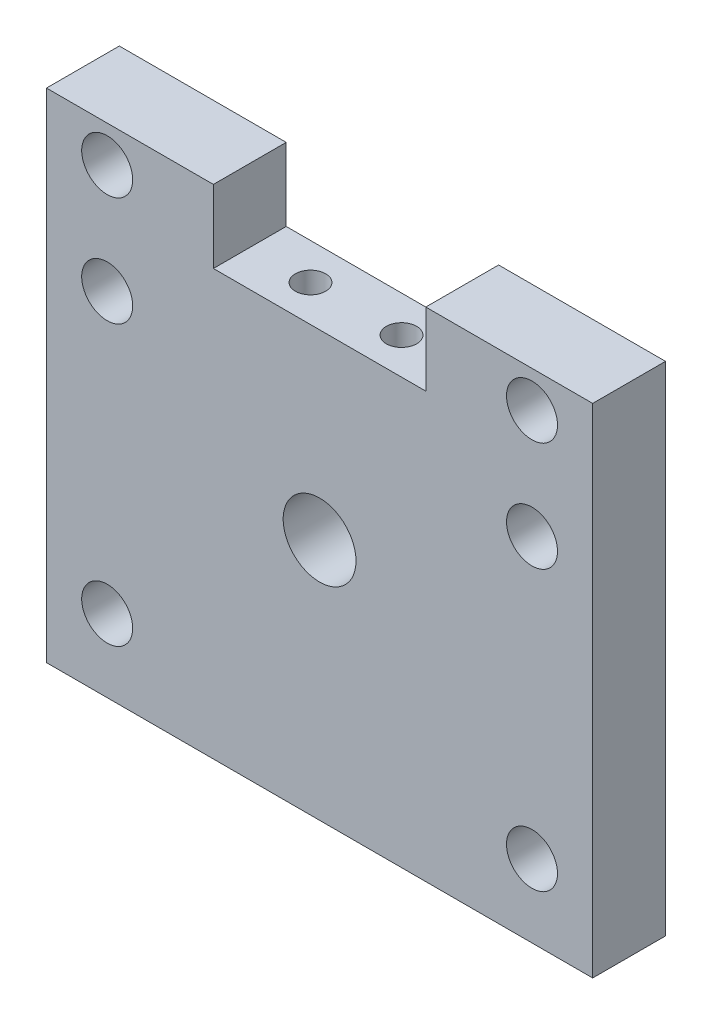
ISO-10303-21;
HEADER;
FILE_DESCRIPTION(('STEP AP214'),'2;1');
FILE_NAME('part.step','',(''),(''),'','','');
FILE_SCHEMA(('AUTOMOTIVE_DESIGN { 1 0 10303 214 1 1 1 1 }'));
ENDSEC;
DATA;
#1=APPLICATION_CONTEXT('core data for automotive mechanical design processes');
#2=APPLICATION_PROTOCOL_DEFINITION('international standard','automotive_design',2000,#1);
#3=PRODUCT_CONTEXT('',#1,'mechanical');
#4=PRODUCT('Part','Part','',(#3));
#5=PRODUCT_RELATED_PRODUCT_CATEGORY('part','',(#4));
#6=PRODUCT_DEFINITION_FORMATION('','',#4);
#7=PRODUCT_DEFINITION_CONTEXT('part definition',#1,'design');
#8=PRODUCT_DEFINITION('design','',#6,#7);
#9=PRODUCT_DEFINITION_SHAPE('','',#8);
#10=(LENGTH_UNIT() NAMED_UNIT(*) SI_UNIT(.MILLI.,.METRE.));
#11=(NAMED_UNIT(*) PLANE_ANGLE_UNIT() SI_UNIT($,.RADIAN.));
#12=(NAMED_UNIT(*) SI_UNIT($,.STERADIAN.) SOLID_ANGLE_UNIT());
#13=UNCERTAINTY_MEASURE_WITH_UNIT(LENGTH_MEASURE(1.E-05),#10,'distance_accuracy_value','');
#14=(GEOMETRIC_REPRESENTATION_CONTEXT(3) GLOBAL_UNCERTAINTY_ASSIGNED_CONTEXT((#13)) GLOBAL_UNIT_ASSIGNED_CONTEXT((#10,
#11,#12)) REPRESENTATION_CONTEXT('',''));
#15=CARTESIAN_POINT('',(0.,0.,0.));
#16=DIRECTION('',(0.,0.,1.));
#17=DIRECTION('',(1.,0.,0.));
#18=AXIS2_PLACEMENT_3D('',#15,#16,#17);
#19=CARTESIAN_POINT('',(-45.,41.,6.));
#20=DIRECTION('',(0.,1.,0.));
#21=DIRECTION('',(0.,0.,1.));
#22=AXIS2_PLACEMENT_3D('',#19,#20,#21);
#23=PLANE('',#22);
#24=DIRECTION('',(1.,0.,0.));
#25=VECTOR('',#24,1.);
#26=CARTESIAN_POINT('',(-45.,41.,-6.));
#27=LINE('',#26,#25);
#28=CARTESIAN_POINT('',(17.5,41.,-6.));
#29=VERTEX_POINT('',#28);
#30=CARTESIAN_POINT('',(45.,41.,-6.));
#31=VERTEX_POINT('',#30);
#32=EDGE_CURVE('E225',#29,#31,#27,.T.);
#33=ORIENTED_EDGE('',*,*,#32,.F.);
#34=DIRECTION('',(0.,0.,1.));
#35=VECTOR('',#34,1.);
#36=CARTESIAN_POINT('',(17.5,41.,6.));
#37=LINE('',#36,#35);
#38=CARTESIAN_POINT('',(17.5,41.,6.));
#39=VERTEX_POINT('',#38);
#40=EDGE_CURVE('E172',#29,#39,#37,.T.);
#41=ORIENTED_EDGE('',*,*,#40,.T.);
#42=DIRECTION('',(1.,0.,0.));
#43=VECTOR('',#42,1.);
#44=CARTESIAN_POINT('',(-45.,41.,6.));
#45=LINE('',#44,#43);
#46=CARTESIAN_POINT('',(45.,41.,6.));
#47=VERTEX_POINT('',#46);
#48=EDGE_CURVE('E214',#39,#47,#45,.T.);
#49=ORIENTED_EDGE('',*,*,#48,.T.);
#50=DIRECTION('',(0.,0.,-1.));
#51=VECTOR('',#50,1.);
#52=CARTESIAN_POINT('',(45.,41.,6.));
#53=LINE('',#52,#51);
#54=EDGE_CURVE('E237',#47,#31,#53,.T.);
#55=ORIENTED_EDGE('',*,*,#54,.T.);
#56=EDGE_LOOP('',(#33,#41,#49,#55));
#57=FACE_BOUND('',#56,.T.);
#58=ADVANCED_FACE('F51',(#57),#23,.T.);
#59=CARTESIAN_POINT('',(-45.,41.,6.));
#60=VERTEX_POINT('',#59);
#61=CARTESIAN_POINT('',(-17.5,41.,6.));
#62=VERTEX_POINT('',#61);
#63=EDGE_CURVE('E216',#60,#62,#45,.T.);
#64=ORIENTED_EDGE('',*,*,#63,.T.);
#65=DIRECTION('',(0.,0.,-1.));
#66=VECTOR('',#65,1.);
#67=CARTESIAN_POINT('',(-17.5,41.,6.));
#68=LINE('',#67,#66);
#69=CARTESIAN_POINT('',(-17.5,41.,-6.));
#70=VERTEX_POINT('',#69);
#71=EDGE_CURVE('E169',#62,#70,#68,.T.);
#72=ORIENTED_EDGE('',*,*,#71,.T.);
#73=CARTESIAN_POINT('',(-45.,41.,-6.));
#74=VERTEX_POINT('',#73);
#75=EDGE_CURVE('E226',#74,#70,#27,.T.);
#76=ORIENTED_EDGE('',*,*,#75,.F.);
#77=DIRECTION('',(0.,0.,-1.));
#78=VECTOR('',#77,1.);
#79=CARTESIAN_POINT('',(-45.,41.,6.));
#80=LINE('',#79,#78);
#81=EDGE_CURVE('E100',#60,#74,#80,.T.);
#82=ORIENTED_EDGE('',*,*,#81,.F.);
#83=EDGE_LOOP('',(#64,#72,#76,#82));
#84=FACE_BOUND('',#83,.T.);
#85=ADVANCED_FACE('F247',(#84),#23,.T.);
#86=CARTESIAN_POINT('',(0.,0.,6.));
#87=DIRECTION('',(0.,0.,-1.));
#88=DIRECTION('',(-1.,0.,0.));
#89=AXIS2_PLACEMENT_3D('',#86,#87,#88);
#90=PLANE('',#89);
#91=CARTESIAN_POINT('',(0.,-0.999999999999997,6.));
#92=DIRECTION('',(0.,0.,1.));
#93=DIRECTION('',(1.,0.,0.));
#94=AXIS2_PLACEMENT_3D('',#91,#92,#93);
#95=CIRCLE('',#94,6.);
#96=CARTESIAN_POINT('',(6.,-0.999999999999997,6.));
#97=VERTEX_POINT('',#96);
#98=EDGE_CURVE('E150',#97,#97,#95,.T.);
#99=ORIENTED_EDGE('',*,*,#98,.F.);
#100=EDGE_LOOP('',(#99));
#101=FACE_BOUND('',#100,.T.);
#102=CARTESIAN_POINT('',(35.,35.,6.));
#103=DIRECTION('',(0.,0.,1.));
#104=DIRECTION('',(1.,0.,0.));
#105=AXIS2_PLACEMENT_3D('',#102,#103,#104);
#106=CIRCLE('',#105,4.19999999999999);
#107=CARTESIAN_POINT('',(39.2,35.,6.));
#108=VERTEX_POINT('',#107);
#109=EDGE_CURVE('E205',#108,#108,#106,.T.);
#110=ORIENTED_EDGE('',*,*,#109,.F.);
#111=EDGE_LOOP('',(#110));
#112=FACE_BOUND('',#111,.T.);
#113=CARTESIAN_POINT('',(-35.,35.,6.));
#114=DIRECTION('',(0.,0.,1.));
#115=DIRECTION('',(1.,0.,0.));
#116=AXIS2_PLACEMENT_3D('',#113,#114,#115);
#117=CIRCLE('',#116,4.19999999999999);
#118=CARTESIAN_POINT('',(-30.8,35.,6.));
#119=VERTEX_POINT('',#118);
#120=EDGE_CURVE('E199',#119,#119,#117,.T.);
#121=ORIENTED_EDGE('',*,*,#120,.F.);
#122=EDGE_LOOP('',(#121));
#123=FACE_BOUND('',#122,.T.);
#124=CARTESIAN_POINT('',(-35.,-29.,6.));
#125=DIRECTION('',(0.,0.,1.));
#126=DIRECTION('',(1.,0.,0.));
#127=AXIS2_PLACEMENT_3D('',#124,#125,#126);
#128=CIRCLE('',#127,4.19999999999999);
#129=CARTESIAN_POINT('',(-30.8,-29.,6.));
#130=VERTEX_POINT('',#129);
#131=EDGE_CURVE('E193',#130,#130,#128,.T.);
#132=ORIENTED_EDGE('',*,*,#131,.F.);
#133=EDGE_LOOP('',(#132));
#134=FACE_BOUND('',#133,.T.);
#135=CARTESIAN_POINT('',(35.,-29.,6.));
#136=DIRECTION('',(0.,0.,1.));
#137=DIRECTION('',(1.,0.,0.));
#138=AXIS2_PLACEMENT_3D('',#135,#136,#137);
#139=CIRCLE('',#138,4.19999999999999);
#140=CARTESIAN_POINT('',(39.2,-29.,6.));
#141=VERTEX_POINT('',#140);
#142=EDGE_CURVE('E187',#141,#141,#139,.T.);
#143=ORIENTED_EDGE('',*,*,#142,.F.);
#144=EDGE_LOOP('',(#143));
#145=FACE_BOUND('',#144,.T.);
#146=CARTESIAN_POINT('',(35.,17.,6.));
#147=DIRECTION('',(0.,0.,1.));
#148=DIRECTION('',(1.,0.,0.));
#149=AXIS2_PLACEMENT_3D('',#146,#147,#148);
#150=CIRCLE('',#149,4.19999999999999);
#151=CARTESIAN_POINT('',(39.2,17.,6.));
#152=VERTEX_POINT('',#151);
#153=EDGE_CURVE('E181',#152,#152,#150,.T.);
#154=ORIENTED_EDGE('',*,*,#153,.F.);
#155=EDGE_LOOP('',(#154));
#156=FACE_BOUND('',#155,.T.);
#157=CARTESIAN_POINT('',(-35.,17.,6.));
#158=DIRECTION('',(0.,0.,1.));
#159=DIRECTION('',(1.,0.,0.));
#160=AXIS2_PLACEMENT_3D('',#157,#158,#159);
#161=CIRCLE('',#160,4.19999999999999);
#162=CARTESIAN_POINT('',(-30.8,17.,6.));
#163=VERTEX_POINT('',#162);
#164=EDGE_CURVE('E175',#163,#163,#161,.T.);
#165=ORIENTED_EDGE('',*,*,#164,.F.);
#166=EDGE_LOOP('',(#165));
#167=FACE_BOUND('',#166,.T.);
#168=DIRECTION('',(0.,-1.,0.));
#169=VECTOR('',#168,1.);
#170=CARTESIAN_POINT('',(17.5,41.000012,6.));
#171=LINE('',#170,#169);
#172=CARTESIAN_POINT('',(17.5,29.,6.));
#173=VERTEX_POINT('',#172);
#174=EDGE_CURVE('E164',#39,#173,#171,.T.);
#175=ORIENTED_EDGE('',*,*,#174,.T.);
#176=DIRECTION('',(1.,0.,0.));
#177=VECTOR('',#176,1.);
#178=CARTESIAN_POINT('',(17.5,29.,6.));
#179=LINE('',#178,#177);
#180=CARTESIAN_POINT('',(-17.5,29.,6.));
#181=VERTEX_POINT('',#180);
#182=EDGE_CURVE('E162',#181,#173,#179,.T.);
#183=ORIENTED_EDGE('',*,*,#182,.F.);
#184=DIRECTION('',(0.,-1.,0.));
#185=VECTOR('',#184,1.);
#186=CARTESIAN_POINT('',(-17.5,41.000012,6.));
#187=LINE('',#186,#185);
#188=EDGE_CURVE('E167',#62,#181,#187,.T.);
#189=ORIENTED_EDGE('',*,*,#188,.F.);
#190=ORIENTED_EDGE('',*,*,#63,.F.);
#191=DIRECTION('',(0.,1.,0.));
#192=VECTOR('',#191,1.);
#193=CARTESIAN_POINT('',(-45.,-41.,6.));
#194=LINE('',#193,#192);
#195=CARTESIAN_POINT('',(-45.,-41.,6.));
#196=VERTEX_POINT('',#195);
#197=EDGE_CURVE('E212',#196,#60,#194,.T.);
#198=ORIENTED_EDGE('',*,*,#197,.F.);
#199=DIRECTION('',(1.,0.,0.));
#200=VECTOR('',#199,1.);
#201=CARTESIAN_POINT('',(-45.,-41.,6.));
#202=LINE('',#201,#200);
#203=CARTESIAN_POINT('',(45.,-41.,6.));
#204=VERTEX_POINT('',#203);
#205=EDGE_CURVE('E221',#196,#204,#202,.T.);
#206=ORIENTED_EDGE('',*,*,#205,.T.);
#207=DIRECTION('',(0.,1.,0.));
#208=VECTOR('',#207,1.);
#209=CARTESIAN_POINT('',(45.,-41.,6.));
#210=LINE('',#209,#208);
#211=EDGE_CURVE('E218',#204,#47,#210,.T.);
#212=ORIENTED_EDGE('',*,*,#211,.T.);
#213=ORIENTED_EDGE('',*,*,#48,.F.);
#214=EDGE_LOOP('',(#175,#183,#189,#190,#198,#206,#212,#213));
#215=FACE_BOUND('',#214,.T.);
#216=ADVANCED_FACE('F250',(#101,#112,#123,#134,#145,#156,#167,#215),#90,.F.);
#217=CARTESIAN_POINT('',(0.,0.,-6.));
#218=DIRECTION('',(0.,0.,-1.));
#219=DIRECTION('',(-1.,0.,0.));
#220=AXIS2_PLACEMENT_3D('',#217,#218,#219);
#221=PLANE('',#220);
#222=CARTESIAN_POINT('',(0.,-0.999999999999997,-6.));
#223=DIRECTION('',(0.,0.,1.));
#224=DIRECTION('',(1.,0.,0.));
#225=AXIS2_PLACEMENT_3D('',#222,#223,#224);
#226=CIRCLE('',#225,6.);
#227=CARTESIAN_POINT('',(6.,-0.999999999999997,-6.));
#228=VERTEX_POINT('',#227);
#229=EDGE_CURVE('E153',#228,#228,#226,.T.);
#230=ORIENTED_EDGE('',*,*,#229,.T.);
#231=EDGE_LOOP('',(#230));
#232=FACE_BOUND('',#231,.T.);
#233=CARTESIAN_POINT('',(-35.,17.,-6.));
#234=DIRECTION('',(0.,0.,1.));
#235=DIRECTION('',(1.,0.,0.));
#236=AXIS2_PLACEMENT_3D('',#233,#234,#235);
#237=CIRCLE('',#236,4.2);
#238=CARTESIAN_POINT('',(-30.8,17.,-6.));
#239=VERTEX_POINT('',#238);
#240=EDGE_CURVE('E178',#239,#239,#237,.T.);
#241=ORIENTED_EDGE('',*,*,#240,.T.);
#242=EDGE_LOOP('',(#241));
#243=FACE_BOUND('',#242,.T.);
#244=CARTESIAN_POINT('',(35.,17.,-6.));
#245=DIRECTION('',(0.,0.,1.));
#246=DIRECTION('',(1.,0.,0.));
#247=AXIS2_PLACEMENT_3D('',#244,#245,#246);
#248=CIRCLE('',#247,4.2);
#249=CARTESIAN_POINT('',(39.2,17.,-6.));
#250=VERTEX_POINT('',#249);
#251=EDGE_CURVE('E184',#250,#250,#248,.T.);
#252=ORIENTED_EDGE('',*,*,#251,.T.);
#253=EDGE_LOOP('',(#252));
#254=FACE_BOUND('',#253,.T.);
#255=CARTESIAN_POINT('',(35.,-29.,-6.));
#256=DIRECTION('',(0.,0.,1.));
#257=DIRECTION('',(1.,0.,0.));
#258=AXIS2_PLACEMENT_3D('',#255,#256,#257);
#259=CIRCLE('',#258,4.2);
#260=CARTESIAN_POINT('',(39.2,-29.,-6.));
#261=VERTEX_POINT('',#260);
#262=EDGE_CURVE('E190',#261,#261,#259,.T.);
#263=ORIENTED_EDGE('',*,*,#262,.T.);
#264=EDGE_LOOP('',(#263));
#265=FACE_BOUND('',#264,.T.);
#266=CARTESIAN_POINT('',(-35.,-29.,-6.));
#267=DIRECTION('',(0.,0.,1.));
#268=DIRECTION('',(1.,0.,0.));
#269=AXIS2_PLACEMENT_3D('',#266,#267,#268);
#270=CIRCLE('',#269,4.2);
#271=CARTESIAN_POINT('',(-30.8,-29.,-6.));
#272=VERTEX_POINT('',#271);
#273=EDGE_CURVE('E196',#272,#272,#270,.T.);
#274=ORIENTED_EDGE('',*,*,#273,.T.);
#275=EDGE_LOOP('',(#274));
#276=FACE_BOUND('',#275,.T.);
#277=CARTESIAN_POINT('',(-35.,35.,-6.));
#278=DIRECTION('',(0.,0.,1.));
#279=DIRECTION('',(1.,0.,0.));
#280=AXIS2_PLACEMENT_3D('',#277,#278,#279);
#281=CIRCLE('',#280,4.2);
#282=CARTESIAN_POINT('',(-30.8,35.,-6.));
#283=VERTEX_POINT('',#282);
#284=EDGE_CURVE('E202',#283,#283,#281,.T.);
#285=ORIENTED_EDGE('',*,*,#284,.T.);
#286=EDGE_LOOP('',(#285));
#287=FACE_BOUND('',#286,.T.);
#288=CARTESIAN_POINT('',(35.,35.,-6.));
#289=DIRECTION('',(0.,0.,1.));
#290=DIRECTION('',(1.,0.,0.));
#291=AXIS2_PLACEMENT_3D('',#288,#289,#290);
#292=CIRCLE('',#291,4.2);
#293=CARTESIAN_POINT('',(39.2,35.,-6.));
#294=VERTEX_POINT('',#293);
#295=EDGE_CURVE('E208',#294,#294,#292,.T.);
#296=ORIENTED_EDGE('',*,*,#295,.T.);
#297=EDGE_LOOP('',(#296));
#298=FACE_BOUND('',#297,.T.);
#299=DIRECTION('',(-1.,0.,0.));
#300=VECTOR('',#299,1.);
#301=CARTESIAN_POINT('',(17.5,29.,-6.));
#302=LINE('',#301,#300);
#303=CARTESIAN_POINT('',(17.5,29.,-6.));
#304=VERTEX_POINT('',#303);
#305=CARTESIAN_POINT('',(-17.5,29.,-6.));
#306=VERTEX_POINT('',#305);
#307=EDGE_CURVE('E157',#304,#306,#302,.T.);
#308=ORIENTED_EDGE('',*,*,#307,.F.);
#309=DIRECTION('',(0.,1.,0.));
#310=VECTOR('',#309,1.);
#311=CARTESIAN_POINT('',(17.5,0.,-6.));
#312=LINE('',#311,#310);
#313=EDGE_CURVE('E11',#304,#29,#312,.T.);
#314=ORIENTED_EDGE('',*,*,#313,.T.);
#315=ORIENTED_EDGE('',*,*,#32,.T.);
#316=DIRECTION('',(0.,1.,0.));
#317=VECTOR('',#316,1.);
#318=CARTESIAN_POINT('',(45.,-41.,-6.));
#319=LINE('',#318,#317);
#320=CARTESIAN_POINT('',(45.,-41.,-6.));
#321=VERTEX_POINT('',#320);
#322=EDGE_CURVE('E229',#321,#31,#319,.T.);
#323=ORIENTED_EDGE('',*,*,#322,.F.);
#324=DIRECTION('',(1.,0.,0.));
#325=VECTOR('',#324,1.);
#326=CARTESIAN_POINT('',(-45.,-41.,-6.));
#327=LINE('',#326,#325);
#328=CARTESIAN_POINT('',(-45.,-41.,-6.));
#329=VERTEX_POINT('',#328);
#330=EDGE_CURVE('E215',#329,#321,#327,.T.);
#331=ORIENTED_EDGE('',*,*,#330,.F.);
#332=DIRECTION('',(0.,1.,0.));
#333=VECTOR('',#332,1.);
#334=CARTESIAN_POINT('',(-45.,-41.,-6.));
#335=LINE('',#334,#333);
#336=EDGE_CURVE('E211',#329,#74,#335,.T.);
#337=ORIENTED_EDGE('',*,*,#336,.T.);
#338=ORIENTED_EDGE('',*,*,#75,.T.);
#339=DIRECTION('',(0.,-1.,0.));
#340=VECTOR('',#339,1.);
#341=CARTESIAN_POINT('',(-17.5,0.,-6.));
#342=LINE('',#341,#340);
#343=EDGE_CURVE('E59',#70,#306,#342,.T.);
#344=ORIENTED_EDGE('',*,*,#343,.T.);
#345=EDGE_LOOP('',(#308,#314,#315,#323,#331,#337,#338,#344));
#346=FACE_BOUND('',#345,.T.);
#347=ADVANCED_FACE('F243',(#232,#243,#254,#265,#276,#287,#298,#346),#221,.T.);
#348=CARTESIAN_POINT('',(-45.,-41.,6.));
#349=DIRECTION('',(-1.,0.,0.));
#350=DIRECTION('',(0.,0.,1.));
#351=AXIS2_PLACEMENT_3D('',#348,#349,#350);
#352=PLANE('',#351);
#353=ORIENTED_EDGE('',*,*,#336,.F.);
#354=DIRECTION('',(0.,0.,-1.));
#355=VECTOR('',#354,1.);
#356=CARTESIAN_POINT('',(-45.,-41.,6.));
#357=LINE('',#356,#355);
#358=EDGE_CURVE('E75',#196,#329,#357,.T.);
#359=ORIENTED_EDGE('',*,*,#358,.F.);
#360=ORIENTED_EDGE('',*,*,#197,.T.);
#361=ORIENTED_EDGE('',*,*,#81,.T.);
#362=EDGE_LOOP('',(#353,#359,#360,#361));
#363=FACE_BOUND('',#362,.T.);
#364=ADVANCED_FACE('F53',(#363),#352,.T.);
#365=CARTESIAN_POINT('',(-45.,-41.,6.));
#366=DIRECTION('',(0.,1.,0.));
#367=DIRECTION('',(0.,0.,1.));
#368=AXIS2_PLACEMENT_3D('',#365,#366,#367);
#369=PLANE('',#368);
#370=ORIENTED_EDGE('',*,*,#330,.T.);
#371=DIRECTION('',(0.,0.,-1.));
#372=VECTOR('',#371,1.);
#373=CARTESIAN_POINT('',(45.,-41.,6.));
#374=LINE('',#373,#372);
#375=EDGE_CURVE('E234',#204,#321,#374,.T.);
#376=ORIENTED_EDGE('',*,*,#375,.F.);
#377=ORIENTED_EDGE('',*,*,#205,.F.);
#378=ORIENTED_EDGE('',*,*,#358,.T.);
#379=EDGE_LOOP('',(#370,#376,#377,#378));
#380=FACE_BOUND('',#379,.T.);
#381=ADVANCED_FACE('F254',(#380),#369,.F.);
#382=CARTESIAN_POINT('',(45.,-41.,6.));
#383=DIRECTION('',(-1.,0.,0.));
#384=DIRECTION('',(0.,0.,1.));
#385=AXIS2_PLACEMENT_3D('',#382,#383,#384);
#386=PLANE('',#385);
#387=ORIENTED_EDGE('',*,*,#322,.T.);
#388=ORIENTED_EDGE('',*,*,#54,.F.);
#389=ORIENTED_EDGE('',*,*,#211,.F.);
#390=ORIENTED_EDGE('',*,*,#375,.T.);
#391=EDGE_LOOP('',(#387,#388,#389,#390));
#392=FACE_BOUND('',#391,.T.);
#393=ADVANCED_FACE('F257',(#392),#386,.F.);
#394=CARTESIAN_POINT('',(35.,35.,6.));
#395=DIRECTION('',(0.,0.,1.));
#396=DIRECTION('',(1.,0.,0.));
#397=AXIS2_PLACEMENT_3D('',#394,#395,#396);
#398=CYLINDRICAL_SURFACE('',#397,4.19999999999999);
#399=ORIENTED_EDGE('',*,*,#295,.F.);
#400=EDGE_LOOP('',(#399));
#401=FACE_BOUND('',#400,.T.);
#402=ORIENTED_EDGE('',*,*,#109,.T.);
#403=EDGE_LOOP('',(#402));
#404=FACE_BOUND('',#403,.T.);
#405=ADVANCED_FACE('F287',(#401,#404),#398,.F.);
#406=CARTESIAN_POINT('',(-35.,35.,6.));
#407=DIRECTION('',(0.,0.,1.));
#408=DIRECTION('',(1.,0.,0.));
#409=AXIS2_PLACEMENT_3D('',#406,#407,#408);
#410=CYLINDRICAL_SURFACE('',#409,4.19999999999999);
#411=ORIENTED_EDGE('',*,*,#284,.F.);
#412=EDGE_LOOP('',(#411));
#413=FACE_BOUND('',#412,.T.);
#414=ORIENTED_EDGE('',*,*,#120,.T.);
#415=EDGE_LOOP('',(#414));
#416=FACE_BOUND('',#415,.T.);
#417=ADVANCED_FACE('F298',(#413,#416),#410,.F.);
#418=CARTESIAN_POINT('',(-35.,-29.,6.));
#419=DIRECTION('',(0.,0.,1.));
#420=DIRECTION('',(1.,0.,0.));
#421=AXIS2_PLACEMENT_3D('',#418,#419,#420);
#422=CYLINDRICAL_SURFACE('',#421,4.19999999999999);
#423=ORIENTED_EDGE('',*,*,#273,.F.);
#424=EDGE_LOOP('',(#423));
#425=FACE_BOUND('',#424,.T.);
#426=ORIENTED_EDGE('',*,*,#131,.T.);
#427=EDGE_LOOP('',(#426));
#428=FACE_BOUND('',#427,.T.);
#429=ADVANCED_FACE('F302',(#425,#428),#422,.F.);
#430=CARTESIAN_POINT('',(35.,-29.,6.));
#431=DIRECTION('',(0.,0.,1.));
#432=DIRECTION('',(1.,0.,0.));
#433=AXIS2_PLACEMENT_3D('',#430,#431,#432);
#434=CYLINDRICAL_SURFACE('',#433,4.19999999999999);
#435=ORIENTED_EDGE('',*,*,#262,.F.);
#436=EDGE_LOOP('',(#435));
#437=FACE_BOUND('',#436,.T.);
#438=ORIENTED_EDGE('',*,*,#142,.T.);
#439=EDGE_LOOP('',(#438));
#440=FACE_BOUND('',#439,.T.);
#441=ADVANCED_FACE('F306',(#437,#440),#434,.F.);
#442=CARTESIAN_POINT('',(35.,17.,6.));
#443=DIRECTION('',(0.,0.,1.));
#444=DIRECTION('',(1.,0.,0.));
#445=AXIS2_PLACEMENT_3D('',#442,#443,#444);
#446=CYLINDRICAL_SURFACE('',#445,4.19999999999999);
#447=ORIENTED_EDGE('',*,*,#251,.F.);
#448=EDGE_LOOP('',(#447));
#449=FACE_BOUND('',#448,.T.);
#450=ORIENTED_EDGE('',*,*,#153,.T.);
#451=EDGE_LOOP('',(#450));
#452=FACE_BOUND('',#451,.T.);
#453=ADVANCED_FACE('F310',(#449,#452),#446,.F.);
#454=CARTESIAN_POINT('',(-35.,17.,6.));
#455=DIRECTION('',(0.,0.,1.));
#456=DIRECTION('',(1.,0.,0.));
#457=AXIS2_PLACEMENT_3D('',#454,#455,#456);
#458=CYLINDRICAL_SURFACE('',#457,4.19999999999999);
#459=ORIENTED_EDGE('',*,*,#240,.F.);
#460=EDGE_LOOP('',(#459));
#461=FACE_BOUND('',#460,.T.);
#462=ORIENTED_EDGE('',*,*,#164,.T.);
#463=EDGE_LOOP('',(#462));
#464=FACE_BOUND('',#463,.T.);
#465=ADVANCED_FACE('F314',(#461,#464),#458,.F.);
#466=CARTESIAN_POINT('',(17.5,41.000012,6.));
#467=DIRECTION('',(-1.,0.,0.));
#468=DIRECTION('',(0.,0.,1.));
#469=AXIS2_PLACEMENT_3D('',#466,#467,#468);
#470=PLANE('',#469);
#471=ORIENTED_EDGE('',*,*,#313,.F.);
#472=DIRECTION('',(0.,0.,-1.));
#473=VECTOR('',#472,1.);
#474=CARTESIAN_POINT('',(17.5,29.,6.));
#475=LINE('',#474,#473);
#476=EDGE_CURVE('E66',#173,#304,#475,.T.);
#477=ORIENTED_EDGE('',*,*,#476,.F.);
#478=ORIENTED_EDGE('',*,*,#174,.F.);
#479=ORIENTED_EDGE('',*,*,#40,.F.);
#480=EDGE_LOOP('',(#471,#477,#478,#479));
#481=FACE_BOUND('',#480,.T.);
#482=ADVANCED_FACE('F263',(#481),#470,.T.);
#483=CARTESIAN_POINT('',(-17.5,41.000012,6.));
#484=DIRECTION('',(1.,0.,0.));
#485=DIRECTION('',(0.,0.,-1.));
#486=AXIS2_PLACEMENT_3D('',#483,#484,#485);
#487=PLANE('',#486);
#488=ORIENTED_EDGE('',*,*,#188,.T.);
#489=DIRECTION('',(0.,0.,1.));
#490=VECTOR('',#489,1.);
#491=CARTESIAN_POINT('',(-17.5,29.,6.));
#492=LINE('',#491,#490);
#493=EDGE_CURVE('E159',#306,#181,#492,.T.);
#494=ORIENTED_EDGE('',*,*,#493,.F.);
#495=ORIENTED_EDGE('',*,*,#343,.F.);
#496=ORIENTED_EDGE('',*,*,#71,.F.);
#497=EDGE_LOOP('',(#488,#494,#495,#496));
#498=FACE_BOUND('',#497,.T.);
#499=ADVANCED_FACE('F245',(#498),#487,.T.);
#500=CARTESIAN_POINT('',(0.,29.,0.));
#501=DIRECTION('',(0.,1.,0.));
#502=DIRECTION('',(0.,0.,1.));
#503=AXIS2_PLACEMENT_3D('',#500,#501,#502);
#504=PLANE('',#503);
#505=CARTESIAN_POINT('',(-7.5,29.,0.));
#506=DIRECTION('',(0.,1.,0.));
#507=DIRECTION('',(0.,0.,1.));
#508=AXIS2_PLACEMENT_3D('',#505,#506,#507);
#509=CIRCLE('',#508,2.49999999999999);
#510=CARTESIAN_POINT('',(-7.5,29.,2.49999999999999));
#511=VERTEX_POINT('',#510);
#512=EDGE_CURVE('E140',#511,#511,#509,.T.);
#513=ORIENTED_EDGE('',*,*,#512,.F.);
#514=EDGE_LOOP('',(#513));
#515=FACE_BOUND('',#514,.T.);
#516=CARTESIAN_POINT('',(7.5,29.,0.));
#517=DIRECTION('',(0.,1.,0.));
#518=DIRECTION('',(0.,0.,1.));
#519=AXIS2_PLACEMENT_3D('',#516,#517,#518);
#520=CIRCLE('',#519,2.49999999999999);
#521=CARTESIAN_POINT('',(7.5,29.,2.49999999999999));
#522=VERTEX_POINT('',#521);
#523=EDGE_CURVE('E139',#522,#522,#520,.T.);
#524=ORIENTED_EDGE('',*,*,#523,.F.);
#525=EDGE_LOOP('',(#524));
#526=FACE_BOUND('',#525,.T.);
#527=ORIENTED_EDGE('',*,*,#476,.T.);
#528=ORIENTED_EDGE('',*,*,#307,.T.);
#529=ORIENTED_EDGE('',*,*,#493,.T.);
#530=ORIENTED_EDGE('',*,*,#182,.T.);
#531=EDGE_LOOP('',(#527,#528,#529,#530));
#532=FACE_BOUND('',#531,.T.);
#533=ADVANCED_FACE('F264',(#515,#526,#532),#504,.T.);
#534=CARTESIAN_POINT('',(0.,-0.999999999999997,6.));
#535=DIRECTION('',(0.,0.,1.));
#536=DIRECTION('',(1.,0.,0.));
#537=AXIS2_PLACEMENT_3D('',#534,#535,#536);
#538=CYLINDRICAL_SURFACE('',#537,6.);
#539=ORIENTED_EDGE('',*,*,#229,.F.);
#540=EDGE_LOOP('',(#539));
#541=FACE_BOUND('',#540,.T.);
#542=ORIENTED_EDGE('',*,*,#98,.T.);
#543=EDGE_LOOP('',(#542));
#544=FACE_BOUND('',#543,.T.);
#545=ADVANCED_FACE('F266',(#541,#544),#538,.F.);
#546=CARTESIAN_POINT('',(7.5,13.5021515475689,0.));
#547=DIRECTION('',(0.,1.,0.));
#548=DIRECTION('',(0.,0.,1.));
#549=AXIS2_PLACEMENT_3D('',#546,#547,#548);
#550=CONICAL_SURFACE('',#549,2.5,1.02974425867665);
#551=CARTESIAN_POINT('',(7.5,12.,0.));
#552=VERTEX_POINT('',#551);
#553=VERTEX_LOOP('',#552);
#554=FACE_BOUND('',#553,.T.);
#555=CARTESIAN_POINT('',(7.5,13.5021515475689,0.));
#556=DIRECTION('',(0.,1.,0.));
#557=DIRECTION('',(0.,0.,1.));
#558=AXIS2_PLACEMENT_3D('',#555,#556,#557);
#559=CIRCLE('',#558,2.5);
#560=CARTESIAN_POINT('',(7.5,13.5021515475689,2.5));
#561=VERTEX_POINT('',#560);
#562=EDGE_CURVE('E143',#561,#561,#559,.T.);
#563=ORIENTED_EDGE('',*,*,#562,.T.);
#564=EDGE_LOOP('',(#563));
#565=FACE_BOUND('',#564,.T.);
#566=ADVANCED_FACE('F272',(#554,#565),#550,.F.);
#567=CARTESIAN_POINT('',(7.5,29.,0.));
#568=DIRECTION('',(0.,1.,0.));
#569=DIRECTION('',(0.,0.,1.));
#570=AXIS2_PLACEMENT_3D('',#567,#568,#569);
#571=CYLINDRICAL_SURFACE('',#570,2.49999999999999);
#572=ORIENTED_EDGE('',*,*,#562,.F.);
#573=EDGE_LOOP('',(#572));
#574=FACE_BOUND('',#573,.T.);
#575=ORIENTED_EDGE('',*,*,#523,.T.);
#576=EDGE_LOOP('',(#575));
#577=FACE_BOUND('',#576,.T.);
#578=ADVANCED_FACE('F133',(#574,#577),#571,.F.);
#579=CARTESIAN_POINT('',(-7.5,13.5021515475689,0.));
#580=DIRECTION('',(0.,1.,0.));
#581=DIRECTION('',(0.,0.,1.));
#582=AXIS2_PLACEMENT_3D('',#579,#580,#581);
#583=CONICAL_SURFACE('',#582,2.5,1.02974425867665);
#584=CARTESIAN_POINT('',(-7.5,12.,0.));
#585=VERTEX_POINT('',#584);
#586=VERTEX_LOOP('',#585);
#587=FACE_BOUND('',#586,.T.);
#588=CARTESIAN_POINT('',(-7.5,13.5021515475689,0.));
#589=DIRECTION('',(0.,1.,0.));
#590=DIRECTION('',(0.,0.,1.));
#591=AXIS2_PLACEMENT_3D('',#588,#589,#590);
#592=CIRCLE('',#591,2.5);
#593=CARTESIAN_POINT('',(-7.5,13.5021515475689,2.5));
#594=VERTEX_POINT('',#593);
#595=EDGE_CURVE('E137',#594,#594,#592,.T.);
#596=ORIENTED_EDGE('',*,*,#595,.T.);
#597=EDGE_LOOP('',(#596));
#598=FACE_BOUND('',#597,.T.);
#599=ADVANCED_FACE('F129',(#587,#598),#583,.F.);
#600=CARTESIAN_POINT('',(-7.5,29.,0.));
#601=DIRECTION('',(0.,1.,0.));
#602=DIRECTION('',(0.,0.,1.));
#603=AXIS2_PLACEMENT_3D('',#600,#601,#602);
#604=CYLINDRICAL_SURFACE('',#603,2.49999999999999);
#605=ORIENTED_EDGE('',*,*,#595,.F.);
#606=EDGE_LOOP('',(#605));
#607=FACE_BOUND('',#606,.T.);
#608=ORIENTED_EDGE('',*,*,#512,.T.);
#609=EDGE_LOOP('',(#608));
#610=FACE_BOUND('',#609,.T.);
#611=ADVANCED_FACE('F132',(#607,#610),#604,.F.);
#612=CLOSED_SHELL('',(#58,#85,#216,#347,#364,#381,#393,#405,#417,#429,#441,#453,#465,#482,#499,
#533,#545,#566,#578,#599,#611));
#613=MANIFOLD_SOLID_BREP('B2',#612);
#614=ADVANCED_BREP_SHAPE_REPRESENTATION('',(#18,#613),#14);
#615=SHAPE_DEFINITION_REPRESENTATION(#9,#614);
ENDSEC;
END-ISO-10303-21;
